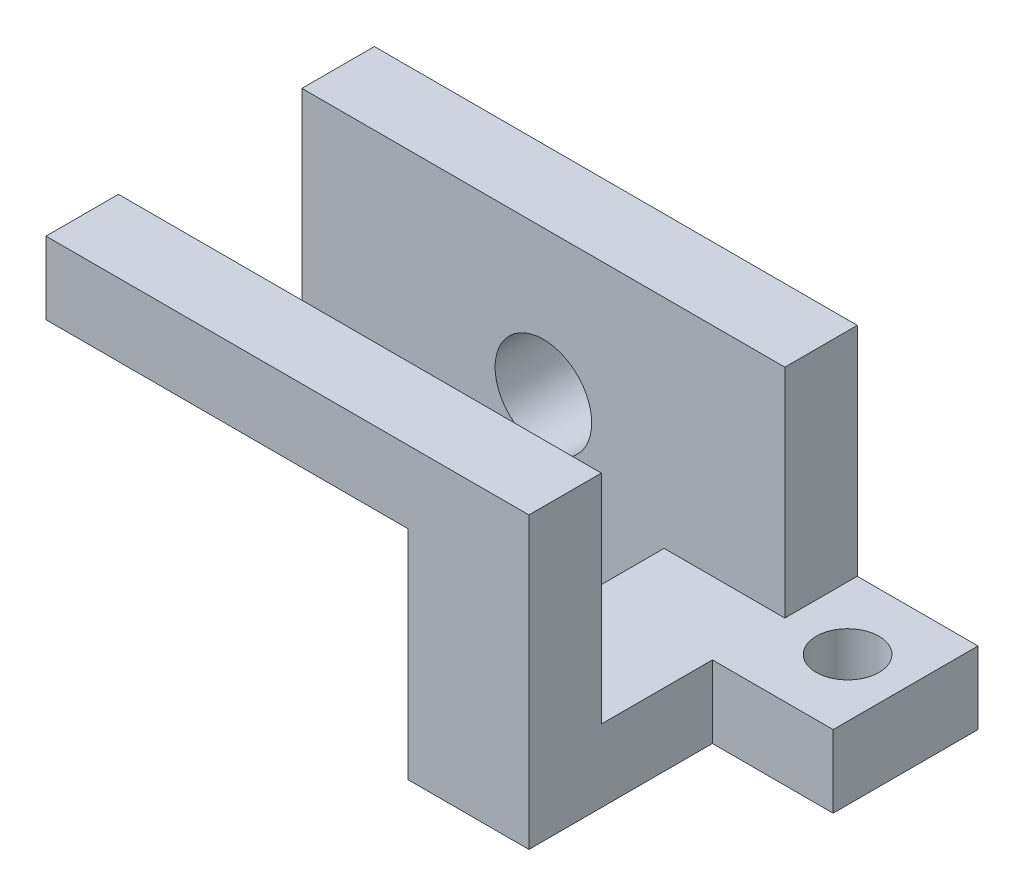
ISO-10303-21;
HEADER;
FILE_DESCRIPTION(('STEP AP214'),'2;1');
FILE_NAME('part.step','',(''),(''),'','','');
FILE_SCHEMA(('AUTOMOTIVE_DESIGN { 1 0 10303 214 1 1 1 1 }'));
ENDSEC;
DATA;
#1=APPLICATION_CONTEXT('core data for automotive mechanical design processes');
#2=APPLICATION_PROTOCOL_DEFINITION('international standard','automotive_design',2000,#1);
#3=PRODUCT_CONTEXT('',#1,'mechanical');
#4=PRODUCT('Part','Part','',(#3));
#5=PRODUCT_RELATED_PRODUCT_CATEGORY('part','',(#4));
#6=PRODUCT_DEFINITION_FORMATION('','',#4);
#7=PRODUCT_DEFINITION_CONTEXT('part definition',#1,'design');
#8=PRODUCT_DEFINITION('design','',#6,#7);
#9=PRODUCT_DEFINITION_SHAPE('','',#8);
#10=(LENGTH_UNIT() NAMED_UNIT(*) SI_UNIT(.MILLI.,.METRE.));
#11=(NAMED_UNIT(*) PLANE_ANGLE_UNIT() SI_UNIT($,.RADIAN.));
#12=(NAMED_UNIT(*) SI_UNIT($,.STERADIAN.) SOLID_ANGLE_UNIT());
#13=UNCERTAINTY_MEASURE_WITH_UNIT(LENGTH_MEASURE(1.E-05),#10,'distance_accuracy_value','');
#14=(GEOMETRIC_REPRESENTATION_CONTEXT(3) GLOBAL_UNCERTAINTY_ASSIGNED_CONTEXT((#13)) GLOBAL_UNIT_ASSIGNED_CONTEXT((#10,
#11,#12)) REPRESENTATION_CONTEXT('',''));
#15=CARTESIAN_POINT('',(0.,0.,0.));
#16=DIRECTION('',(0.,0.,1.));
#17=DIRECTION('',(1.,0.,0.));
#18=AXIS2_PLACEMENT_3D('',#15,#16,#17);
#19=CARTESIAN_POINT('',(0.,15.,0.));
#20=DIRECTION('',(0.,1.,0.));
#21=DIRECTION('',(0.,0.,1.));
#22=AXIS2_PLACEMENT_3D('',#19,#20,#21);
#23=PLANE('',#22);
#24=CARTESIAN_POINT('',(63.,15.,0.));
#25=DIRECTION('',(0.,1.,0.));
#26=DIRECTION('',(0.,0.,1.));
#27=AXIS2_PLACEMENT_3D('',#24,#25,#26);
#28=CIRCLE('',#27,6.5);
#29=CARTESIAN_POINT('',(63.,15.,6.5));
#30=VERTEX_POINT('',#29);
#31=EDGE_CURVE('E206',#30,#30,#28,.T.);
#32=ORIENTED_EDGE('',*,*,#31,.F.);
#33=EDGE_LOOP('',(#32));
#34=FACE_BOUND('',#33,.T.);
#35=DIRECTION('',(0.,0.,1.));
#36=VECTOR('',#35,1.);
#37=CARTESIAN_POINT('',(25.,15.,0.));
#38=LINE('',#37,#36);
#39=CARTESIAN_POINT('',(25.,15.,0.));
#40=VERTEX_POINT('',#39);
#41=CARTESIAN_POINT('',(25.,15.,38.));
#42=VERTEX_POINT('',#41);
#43=EDGE_CURVE('E203',#40,#42,#38,.T.);
#44=ORIENTED_EDGE('',*,*,#43,.T.);
#45=DIRECTION('',(1.,0.,0.));
#46=VECTOR('',#45,1.);
#47=CARTESIAN_POINT('',(0.,15.,38.));
#48=LINE('',#47,#46);
#49=CARTESIAN_POINT('',(50.,15.,38.));
#50=VERTEX_POINT('',#49);
#51=EDGE_CURVE('E11',#42,#50,#48,.T.);
#52=ORIENTED_EDGE('',*,*,#51,.T.);
#53=DIRECTION('',(0.,0.,1.));
#54=VECTOR('',#53,1.);
#55=CARTESIAN_POINT('',(50.,15.,0.));
#56=LINE('',#55,#54);
#57=CARTESIAN_POINT('',(50.,15.,15.));
#58=VERTEX_POINT('',#57);
#59=EDGE_CURVE('E182',#58,#50,#56,.T.);
#60=ORIENTED_EDGE('',*,*,#59,.F.);
#61=DIRECTION('',(1.,0.,0.));
#62=VECTOR('',#61,1.);
#63=CARTESIAN_POINT('',(0.,15.,15.));
#64=LINE('',#63,#62);
#65=CARTESIAN_POINT('',(75.,15.,15.));
#66=VERTEX_POINT('',#65);
#67=EDGE_CURVE('E185',#58,#66,#64,.T.);
#68=ORIENTED_EDGE('',*,*,#67,.T.);
#69=DIRECTION('',(0.,0.,1.));
#70=VECTOR('',#69,1.);
#71=CARTESIAN_POINT('',(75.,15.,0.));
#72=LINE('',#71,#70);
#73=CARTESIAN_POINT('',(75.,15.,-15.));
#74=VERTEX_POINT('',#73);
#75=EDGE_CURVE('E189',#74,#66,#72,.T.);
#76=ORIENTED_EDGE('',*,*,#75,.F.);
#77=DIRECTION('',(1.,0.,0.));
#78=VECTOR('',#77,1.);
#79=CARTESIAN_POINT('',(0.,15.,-15.));
#80=LINE('',#79,#78);
#81=CARTESIAN_POINT('',(50.,15.,-15.));
#82=VERTEX_POINT('',#81);
#83=EDGE_CURVE('E193',#82,#74,#80,.T.);
#84=ORIENTED_EDGE('',*,*,#83,.F.);
#85=DIRECTION('',(0.,0.,-1.));
#86=VECTOR('',#85,1.);
#87=CARTESIAN_POINT('',(50.,15.,0.));
#88=LINE('',#87,#86);
#89=CARTESIAN_POINT('',(50.,15.,0.));
#90=VERTEX_POINT('',#89);
#91=EDGE_CURVE('E197',#90,#82,#88,.T.);
#92=ORIENTED_EDGE('',*,*,#91,.F.);
#93=DIRECTION('',(1.,0.,0.));
#94=VECTOR('',#93,1.);
#95=CARTESIAN_POINT('',(0.,15.,0.));
#96=LINE('',#95,#94);
#97=EDGE_CURVE('E200',#40,#90,#96,.T.);
#98=ORIENTED_EDGE('',*,*,#97,.F.);
#99=EDGE_LOOP('',(#44,#52,#60,#68,#76,#84,#92,#98));
#100=FACE_BOUND('',#99,.T.);
#101=ADVANCED_FACE('F47',(#34,#100),#23,.T.);
#102=CARTESIAN_POINT('',(0.,60.,0.));
#103=DIRECTION('',(0.,0.,-1.));
#104=DIRECTION('',(-1.,0.,0.));
#105=AXIS2_PLACEMENT_3D('',#102,#103,#104);
#106=PLANE('',#105);
#107=CARTESIAN_POINT('',(0.,30.,0.));
#108=DIRECTION('',(0.,0.,1.));
#109=DIRECTION('',(1.,0.,0.));
#110=AXIS2_PLACEMENT_3D('',#107,#108,#109);
#111=CIRCLE('',#110,10.);
#112=CARTESIAN_POINT('',(10.,30.,0.));
#113=VERTEX_POINT('',#112);
#114=EDGE_CURVE('E320',#113,#113,#111,.T.);
#115=ORIENTED_EDGE('',*,*,#114,.F.);
#116=EDGE_LOOP('',(#115));
#117=FACE_BOUND('',#116,.T.);
#118=DIRECTION('',(0.,-1.,0.));
#119=VECTOR('',#118,1.);
#120=CARTESIAN_POINT('',(25.,15.,0.));
#121=LINE('',#120,#119);
#122=CARTESIAN_POINT('',(25.,0.,0.));
#123=VERTEX_POINT('',#122);
#124=EDGE_CURVE('E232',#40,#123,#121,.T.);
#125=ORIENTED_EDGE('',*,*,#124,.F.);
#126=ORIENTED_EDGE('',*,*,#97,.T.);
#127=DIRECTION('',(0.,-1.,0.));
#128=VECTOR('',#127,1.);
#129=CARTESIAN_POINT('',(50.,60.,0.));
#130=LINE('',#129,#128);
#131=CARTESIAN_POINT('',(50.,60.,0.));
#132=VERTEX_POINT('',#131);
#133=EDGE_CURVE('E56',#132,#90,#130,.T.);
#134=ORIENTED_EDGE('',*,*,#133,.F.);
#135=DIRECTION('',(1.,0.,0.));
#136=VECTOR('',#135,1.);
#137=CARTESIAN_POINT('',(0.,60.,0.));
#138=LINE('',#137,#136);
#139=CARTESIAN_POINT('',(-50.,60.,0.));
#140=VERTEX_POINT('',#139);
#141=EDGE_CURVE('E251',#140,#132,#138,.T.);
#142=ORIENTED_EDGE('',*,*,#141,.F.);
#143=DIRECTION('',(0.,-1.,0.));
#144=VECTOR('',#143,1.);
#145=CARTESIAN_POINT('',(-50.,60.,0.));
#146=LINE('',#145,#144);
#147=CARTESIAN_POINT('',(-50.,0.,0.));
#148=VERTEX_POINT('',#147);
#149=EDGE_CURVE('E267',#140,#148,#146,.T.);
#150=ORIENTED_EDGE('',*,*,#149,.T.);
#151=DIRECTION('',(1.,0.,0.));
#152=VECTOR('',#151,1.);
#153=CARTESIAN_POINT('',(0.,0.,0.));
#154=LINE('',#153,#152);
#155=EDGE_CURVE('E250',#148,#123,#154,.T.);
#156=ORIENTED_EDGE('',*,*,#155,.T.);
#157=EDGE_LOOP('',(#125,#126,#134,#142,#150,#156));
#158=FACE_BOUND('',#157,.T.);
#159=ADVANCED_FACE('F49',(#117,#158),#106,.F.);
#160=CARTESIAN_POINT('',(50.,60.,0.));
#161=DIRECTION('',(-1.,0.,0.));
#162=DIRECTION('',(0.,0.,1.));
#163=AXIS2_PLACEMENT_3D('',#160,#161,#162);
#164=PLANE('',#163);
#165=ORIENTED_EDGE('',*,*,#133,.T.);
#166=ORIENTED_EDGE('',*,*,#91,.T.);
#167=DIRECTION('',(0.,-1.,0.));
#168=VECTOR('',#167,1.);
#169=CARTESIAN_POINT('',(50.,60.,-15.));
#170=LINE('',#169,#168);
#171=CARTESIAN_POINT('',(50.,60.,-15.));
#172=VERTEX_POINT('',#171);
#173=EDGE_CURVE('E281',#172,#82,#170,.T.);
#174=ORIENTED_EDGE('',*,*,#173,.F.);
#175=DIRECTION('',(0.,0.,-1.));
#176=VECTOR('',#175,1.);
#177=CARTESIAN_POINT('',(50.,60.,0.));
#178=LINE('',#177,#176);
#179=EDGE_CURVE('E255',#132,#172,#178,.T.);
#180=ORIENTED_EDGE('',*,*,#179,.F.);
#181=EDGE_LOOP('',(#165,#166,#174,#180));
#182=FACE_BOUND('',#181,.T.);
#183=ADVANCED_FACE('F289',(#182),#164,.F.);
#184=CARTESIAN_POINT('',(0.,60.,-15.));
#185=DIRECTION('',(0.,0.,-1.));
#186=DIRECTION('',(-1.,0.,0.));
#187=AXIS2_PLACEMENT_3D('',#184,#185,#186);
#188=PLANE('',#187);
#189=CARTESIAN_POINT('',(0.,30.,-15.));
#190=DIRECTION('',(0.,0.,1.));
#191=DIRECTION('',(1.,0.,0.));
#192=AXIS2_PLACEMENT_3D('',#189,#190,#191);
#193=CIRCLE('',#192,10.);
#194=CARTESIAN_POINT('',(10.,30.,-15.));
#195=VERTEX_POINT('',#194);
#196=EDGE_CURVE('E323',#195,#195,#193,.T.);
#197=ORIENTED_EDGE('',*,*,#196,.T.);
#198=EDGE_LOOP('',(#197));
#199=FACE_BOUND('',#198,.T.);
#200=DIRECTION('',(1.,0.,0.));
#201=VECTOR('',#200,1.);
#202=CARTESIAN_POINT('',(0.,0.,-15.));
#203=LINE('',#202,#201);
#204=CARTESIAN_POINT('',(-50.,0.,-15.));
#205=VERTEX_POINT('',#204);
#206=CARTESIAN_POINT('',(75.,0.,-15.));
#207=VERTEX_POINT('',#206);
#208=EDGE_CURVE('E270',#205,#207,#203,.T.);
#209=ORIENTED_EDGE('',*,*,#208,.F.);
#210=DIRECTION('',(0.,-1.,0.));
#211=VECTOR('',#210,1.);
#212=CARTESIAN_POINT('',(-50.,60.,-15.));
#213=LINE('',#212,#211);
#214=CARTESIAN_POINT('',(-50.,60.,-15.));
#215=VERTEX_POINT('',#214);
#216=EDGE_CURVE('E278',#215,#205,#213,.T.);
#217=ORIENTED_EDGE('',*,*,#216,.F.);
#218=DIRECTION('',(1.,0.,0.));
#219=VECTOR('',#218,1.);
#220=CARTESIAN_POINT('',(0.,60.,-15.));
#221=LINE('',#220,#219);
#222=EDGE_CURVE('E259',#215,#172,#221,.T.);
#223=ORIENTED_EDGE('',*,*,#222,.T.);
#224=ORIENTED_EDGE('',*,*,#173,.T.);
#225=ORIENTED_EDGE('',*,*,#83,.T.);
#226=DIRECTION('',(0.,-1.,0.));
#227=VECTOR('',#226,1.);
#228=CARTESIAN_POINT('',(75.,15.,-15.));
#229=LINE('',#228,#227);
#230=EDGE_CURVE('E236',#74,#207,#229,.T.);
#231=ORIENTED_EDGE('',*,*,#230,.T.);
#232=EDGE_LOOP('',(#209,#217,#223,#224,#225,#231));
#233=FACE_BOUND('',#232,.T.);
#234=ADVANCED_FACE('F298',(#199,#233),#188,.T.);
#235=CARTESIAN_POINT('',(-50.,60.,0.));
#236=DIRECTION('',(-1.,0.,0.));
#237=DIRECTION('',(0.,0.,1.));
#238=AXIS2_PLACEMENT_3D('',#235,#236,#237);
#239=PLANE('',#238);
#240=DIRECTION('',(0.,0.,-1.));
#241=VECTOR('',#240,1.);
#242=CARTESIAN_POINT('',(-50.,0.,0.));
#243=LINE('',#242,#241);
#244=EDGE_CURVE('E256',#148,#205,#243,.T.);
#245=ORIENTED_EDGE('',*,*,#244,.F.);
#246=ORIENTED_EDGE('',*,*,#149,.F.);
#247=DIRECTION('',(0.,0.,-1.));
#248=VECTOR('',#247,1.);
#249=CARTESIAN_POINT('',(-50.,60.,0.));
#250=LINE('',#249,#248);
#251=EDGE_CURVE('E263',#140,#215,#250,.T.);
#252=ORIENTED_EDGE('',*,*,#251,.T.);
#253=ORIENTED_EDGE('',*,*,#216,.T.);
#254=EDGE_LOOP('',(#245,#246,#252,#253));
#255=FACE_BOUND('',#254,.T.);
#256=ADVANCED_FACE('F306',(#255),#239,.T.);
#257=CARTESIAN_POINT('',(0.,60.,0.));
#258=DIRECTION('',(0.,1.,0.));
#259=DIRECTION('',(0.,0.,1.));
#260=AXIS2_PLACEMENT_3D('',#257,#258,#259);
#261=PLANE('',#260);
#262=ORIENTED_EDGE('',*,*,#141,.T.);
#263=ORIENTED_EDGE('',*,*,#179,.T.);
#264=ORIENTED_EDGE('',*,*,#222,.F.);
#265=ORIENTED_EDGE('',*,*,#251,.F.);
#266=EDGE_LOOP('',(#262,#263,#264,#265));
#267=FACE_BOUND('',#266,.T.);
#268=ADVANCED_FACE('F303',(#267),#261,.T.);
#269=CARTESIAN_POINT('',(0.,0.,0.));
#270=DIRECTION('',(0.,1.,0.));
#271=DIRECTION('',(0.,0.,1.));
#272=AXIS2_PLACEMENT_3D('',#269,#270,#271);
#273=PLANE('',#272);
#274=DIRECTION('',(-1.,0.,0.));
#275=VECTOR('',#274,1.);
#276=CARTESIAN_POINT('',(0.,0.,53.));
#277=LINE('',#276,#275);
#278=CARTESIAN_POINT('',(50.,0.,53.));
#279=VERTEX_POINT('',#278);
#280=CARTESIAN_POINT('',(25.,0.,53.));
#281=VERTEX_POINT('',#280);
#282=EDGE_CURVE('E176',#279,#281,#277,.T.);
#283=ORIENTED_EDGE('',*,*,#282,.T.);
#284=DIRECTION('',(0.,0.,1.));
#285=VECTOR('',#284,1.);
#286=CARTESIAN_POINT('',(25.,0.,0.));
#287=LINE('',#286,#285);
#288=EDGE_CURVE('E224',#123,#281,#287,.T.);
#289=ORIENTED_EDGE('',*,*,#288,.F.);
#290=ORIENTED_EDGE('',*,*,#155,.F.);
#291=ORIENTED_EDGE('',*,*,#244,.T.);
#292=ORIENTED_EDGE('',*,*,#208,.T.);
#293=DIRECTION('',(0.,0.,1.));
#294=VECTOR('',#293,1.);
#295=CARTESIAN_POINT('',(75.,0.,0.));
#296=LINE('',#295,#294);
#297=CARTESIAN_POINT('',(75.,0.,15.));
#298=VERTEX_POINT('',#297);
#299=EDGE_CURVE('E220',#207,#298,#296,.T.);
#300=ORIENTED_EDGE('',*,*,#299,.T.);
#301=DIRECTION('',(1.,0.,0.));
#302=VECTOR('',#301,1.);
#303=CARTESIAN_POINT('',(0.,0.,15.));
#304=LINE('',#303,#302);
#305=CARTESIAN_POINT('',(50.,0.,15.));
#306=VERTEX_POINT('',#305);
#307=EDGE_CURVE('E216',#306,#298,#304,.T.);
#308=ORIENTED_EDGE('',*,*,#307,.F.);
#309=DIRECTION('',(0.,0.,1.));
#310=VECTOR('',#309,1.);
#311=CARTESIAN_POINT('',(50.,0.,0.));
#312=LINE('',#311,#310);
#313=EDGE_CURVE('E213',#306,#279,#312,.T.);
#314=ORIENTED_EDGE('',*,*,#313,.T.);
#315=EDGE_LOOP('',(#283,#289,#290,#291,#292,#300,#308,#314));
#316=FACE_BOUND('',#315,.T.);
#317=CARTESIAN_POINT('',(63.,0.,0.));
#318=DIRECTION('',(0.,1.,0.));
#319=DIRECTION('',(0.,0.,1.));
#320=AXIS2_PLACEMENT_3D('',#317,#318,#319);
#321=CIRCLE('',#320,6.5);
#322=CARTESIAN_POINT('',(63.,0.,6.5));
#323=VERTEX_POINT('',#322);
#324=EDGE_CURVE('E186',#323,#323,#321,.T.);
#325=ORIENTED_EDGE('',*,*,#324,.T.);
#326=EDGE_LOOP('',(#325));
#327=FACE_BOUND('',#326,.T.);
#328=ADVANCED_FACE('F364',(#316,#327),#273,.F.);
#329=CARTESIAN_POINT('',(0.,15.,53.));
#330=DIRECTION('',(0.,0.,1.));
#331=DIRECTION('',(1.,0.,0.));
#332=AXIS2_PLACEMENT_3D('',#329,#330,#331);
#333=PLANE('',#332);
#334=ORIENTED_EDGE('',*,*,#282,.F.);
#335=DIRECTION('',(0.,-1.,0.));
#336=VECTOR('',#335,1.);
#337=CARTESIAN_POINT('',(50.,15.,53.));
#338=LINE('',#337,#336);
#339=CARTESIAN_POINT('',(50.,60.,53.));
#340=VERTEX_POINT('',#339);
#341=EDGE_CURVE('E246',#340,#279,#338,.T.);
#342=ORIENTED_EDGE('',*,*,#341,.F.);
#343=DIRECTION('',(-1.,0.,0.));
#344=VECTOR('',#343,1.);
#345=CARTESIAN_POINT('',(0.,60.,53.));
#346=LINE('',#345,#344);
#347=CARTESIAN_POINT('',(-50.,60.,53.));
#348=VERTEX_POINT('',#347);
#349=EDGE_CURVE('E342',#340,#348,#346,.T.);
#350=ORIENTED_EDGE('',*,*,#349,.T.);
#351=DIRECTION('',(0.,1.,0.));
#352=VECTOR('',#351,1.);
#353=CARTESIAN_POINT('',(-50.,45.,53.));
#354=LINE('',#353,#352);
#355=CARTESIAN_POINT('',(-50.,45.,53.));
#356=VERTEX_POINT('',#355);
#357=EDGE_CURVE('E338',#356,#348,#354,.T.);
#358=ORIENTED_EDGE('',*,*,#357,.F.);
#359=DIRECTION('',(1.,0.,0.));
#360=VECTOR('',#359,1.);
#361=CARTESIAN_POINT('',(0.,45.,53.));
#362=LINE('',#361,#360);
#363=CARTESIAN_POINT('',(25.,45.,53.));
#364=VERTEX_POINT('',#363);
#365=EDGE_CURVE('E331',#356,#364,#362,.T.);
#366=ORIENTED_EDGE('',*,*,#365,.T.);
#367=DIRECTION('',(0.,-1.,0.));
#368=VECTOR('',#367,1.);
#369=CARTESIAN_POINT('',(25.,15.,53.));
#370=LINE('',#369,#368);
#371=EDGE_CURVE('E164',#364,#281,#370,.T.);
#372=ORIENTED_EDGE('',*,*,#371,.T.);
#373=EDGE_LOOP('',(#334,#342,#350,#358,#366,#372));
#374=FACE_BOUND('',#373,.T.);
#375=ADVANCED_FACE('F359',(#374),#333,.T.);
#376=CARTESIAN_POINT('',(50.,15.,0.));
#377=DIRECTION('',(1.,0.,0.));
#378=DIRECTION('',(0.,0.,-1.));
#379=AXIS2_PLACEMENT_3D('',#376,#377,#378);
#380=PLANE('',#379);
#381=ORIENTED_EDGE('',*,*,#341,.T.);
#382=ORIENTED_EDGE('',*,*,#313,.F.);
#383=DIRECTION('',(0.,-1.,0.));
#384=VECTOR('',#383,1.);
#385=CARTESIAN_POINT('',(50.,15.,15.));
#386=LINE('',#385,#384);
#387=EDGE_CURVE('E243',#58,#306,#386,.T.);
#388=ORIENTED_EDGE('',*,*,#387,.F.);
#389=ORIENTED_EDGE('',*,*,#59,.T.);
#390=DIRECTION('',(0.,-1.,0.));
#391=VECTOR('',#390,1.);
#392=CARTESIAN_POINT('',(50.,60.,38.));
#393=LINE('',#392,#391);
#394=CARTESIAN_POINT('',(50.,60.,38.));
#395=VERTEX_POINT('',#394);
#396=EDGE_CURVE('E171',#395,#50,#393,.T.);
#397=ORIENTED_EDGE('',*,*,#396,.F.);
#398=DIRECTION('',(0.,0.,1.));
#399=VECTOR('',#398,1.);
#400=CARTESIAN_POINT('',(50.,60.,0.));
#401=LINE('',#400,#399);
#402=EDGE_CURVE('E178',#395,#340,#401,.T.);
#403=ORIENTED_EDGE('',*,*,#402,.T.);
#404=EDGE_LOOP('',(#381,#382,#388,#389,#397,#403));
#405=FACE_BOUND('',#404,.T.);
#406=ADVANCED_FACE('F350',(#405),#380,.T.);
#407=CARTESIAN_POINT('',(0.,15.,15.));
#408=DIRECTION('',(0.,0.,-1.));
#409=DIRECTION('',(-1.,0.,0.));
#410=AXIS2_PLACEMENT_3D('',#407,#408,#409);
#411=PLANE('',#410);
#412=ORIENTED_EDGE('',*,*,#307,.T.);
#413=DIRECTION('',(0.,-1.,0.));
#414=VECTOR('',#413,1.);
#415=CARTESIAN_POINT('',(75.,15.,15.));
#416=LINE('',#415,#414);
#417=EDGE_CURVE('E240',#66,#298,#416,.T.);
#418=ORIENTED_EDGE('',*,*,#417,.F.);
#419=ORIENTED_EDGE('',*,*,#67,.F.);
#420=ORIENTED_EDGE('',*,*,#387,.T.);
#421=EDGE_LOOP('',(#412,#418,#419,#420));
#422=FACE_BOUND('',#421,.T.);
#423=ADVANCED_FACE('F370',(#422),#411,.F.);
#424=CARTESIAN_POINT('',(75.,15.,0.));
#425=DIRECTION('',(1.,0.,0.));
#426=DIRECTION('',(0.,0.,-1.));
#427=AXIS2_PLACEMENT_3D('',#424,#425,#426);
#428=PLANE('',#427);
#429=ORIENTED_EDGE('',*,*,#299,.F.);
#430=ORIENTED_EDGE('',*,*,#230,.F.);
#431=ORIENTED_EDGE('',*,*,#75,.T.);
#432=ORIENTED_EDGE('',*,*,#417,.T.);
#433=EDGE_LOOP('',(#429,#430,#431,#432));
#434=FACE_BOUND('',#433,.T.);
#435=ADVANCED_FACE('F372',(#434),#428,.T.);
#436=CARTESIAN_POINT('',(25.,15.,0.));
#437=DIRECTION('',(1.,0.,0.));
#438=DIRECTION('',(0.,0.,-1.));
#439=AXIS2_PLACEMENT_3D('',#436,#437,#438);
#440=PLANE('',#439);
#441=ORIENTED_EDGE('',*,*,#371,.F.);
#442=DIRECTION('',(0.,0.,-1.));
#443=VECTOR('',#442,1.);
#444=CARTESIAN_POINT('',(25.,45.,0.));
#445=LINE('',#444,#443);
#446=CARTESIAN_POINT('',(25.,45.,38.));
#447=VERTEX_POINT('',#446);
#448=EDGE_CURVE('E152',#364,#447,#445,.T.);
#449=ORIENTED_EDGE('',*,*,#448,.T.);
#450=DIRECTION('',(0.,-1.,0.));
#451=VECTOR('',#450,1.);
#452=CARTESIAN_POINT('',(25.,60.,38.));
#453=LINE('',#452,#451);
#454=EDGE_CURVE('E63',#447,#42,#453,.T.);
#455=ORIENTED_EDGE('',*,*,#454,.T.);
#456=ORIENTED_EDGE('',*,*,#43,.F.);
#457=ORIENTED_EDGE('',*,*,#124,.T.);
#458=ORIENTED_EDGE('',*,*,#288,.T.);
#459=EDGE_LOOP('',(#441,#449,#455,#456,#457,#458));
#460=FACE_BOUND('',#459,.T.);
#461=ADVANCED_FACE('F162',(#460),#440,.F.);
#462=CARTESIAN_POINT('',(63.,15.,0.));
#463=DIRECTION('',(0.,-1.,0.));
#464=DIRECTION('',(0.,0.,-1.));
#465=AXIS2_PLACEMENT_3D('',#462,#463,#464);
#466=CYLINDRICAL_SURFACE('',#465,6.5);
#467=ORIENTED_EDGE('',*,*,#31,.T.);
#468=EDGE_LOOP('',(#467));
#469=FACE_BOUND('',#468,.T.);
#470=ORIENTED_EDGE('',*,*,#324,.F.);
#471=EDGE_LOOP('',(#470));
#472=FACE_BOUND('',#471,.T.);
#473=ADVANCED_FACE('F380',(#469,#472),#466,.F.);
#474=CARTESIAN_POINT('',(0.,60.,38.));
#475=DIRECTION('',(0.,0.,1.));
#476=DIRECTION('',(1.,0.,0.));
#477=AXIS2_PLACEMENT_3D('',#474,#475,#476);
#478=PLANE('',#477);
#479=ORIENTED_EDGE('',*,*,#51,.F.);
#480=ORIENTED_EDGE('',*,*,#454,.F.);
#481=DIRECTION('',(1.,0.,0.));
#482=VECTOR('',#481,1.);
#483=CARTESIAN_POINT('',(0.,45.,38.));
#484=LINE('',#483,#482);
#485=CARTESIAN_POINT('',(-50.,45.,38.));
#486=VERTEX_POINT('',#485);
#487=EDGE_CURVE('E149',#486,#447,#484,.T.);
#488=ORIENTED_EDGE('',*,*,#487,.F.);
#489=DIRECTION('',(0.,1.,0.));
#490=VECTOR('',#489,1.);
#491=CARTESIAN_POINT('',(-50.,45.,38.));
#492=LINE('',#491,#490);
#493=CARTESIAN_POINT('',(-50.,60.,38.));
#494=VERTEX_POINT('',#493);
#495=EDGE_CURVE('E334',#486,#494,#492,.T.);
#496=ORIENTED_EDGE('',*,*,#495,.T.);
#497=DIRECTION('',(-1.,0.,0.));
#498=VECTOR('',#497,1.);
#499=CARTESIAN_POINT('',(0.,60.,38.));
#500=LINE('',#499,#498);
#501=EDGE_CURVE('E172',#395,#494,#500,.T.);
#502=ORIENTED_EDGE('',*,*,#501,.F.);
#503=ORIENTED_EDGE('',*,*,#396,.T.);
#504=EDGE_LOOP('',(#479,#480,#488,#496,#502,#503));
#505=FACE_BOUND('',#504,.T.);
#506=ADVANCED_FACE('F168',(#505),#478,.F.);
#507=CARTESIAN_POINT('',(0.,60.,0.));
#508=DIRECTION('',(0.,1.,0.));
#509=DIRECTION('',(0.,0.,1.));
#510=AXIS2_PLACEMENT_3D('',#507,#508,#509);
#511=PLANE('',#510);
#512=ORIENTED_EDGE('',*,*,#349,.F.);
#513=ORIENTED_EDGE('',*,*,#402,.F.);
#514=ORIENTED_EDGE('',*,*,#501,.T.);
#515=DIRECTION('',(0.,0.,-1.));
#516=VECTOR('',#515,1.);
#517=CARTESIAN_POINT('',(-50.,60.,0.));
#518=LINE('',#517,#516);
#519=EDGE_CURVE('E166',#348,#494,#518,.T.);
#520=ORIENTED_EDGE('',*,*,#519,.F.);
#521=EDGE_LOOP('',(#512,#513,#514,#520));
#522=FACE_BOUND('',#521,.T.);
#523=ADVANCED_FACE('F356',(#522),#511,.T.);
#524=CARTESIAN_POINT('',(-50.,45.,0.));
#525=DIRECTION('',(1.,0.,0.));
#526=DIRECTION('',(0.,0.,-1.));
#527=AXIS2_PLACEMENT_3D('',#524,#525,#526);
#528=PLANE('',#527);
#529=ORIENTED_EDGE('',*,*,#519,.T.);
#530=ORIENTED_EDGE('',*,*,#495,.F.);
#531=DIRECTION('',(0.,0.,-1.));
#532=VECTOR('',#531,1.);
#533=CARTESIAN_POINT('',(-50.,45.,0.));
#534=LINE('',#533,#532);
#535=EDGE_CURVE('E155',#356,#486,#534,.T.);
#536=ORIENTED_EDGE('',*,*,#535,.F.);
#537=ORIENTED_EDGE('',*,*,#357,.T.);
#538=EDGE_LOOP('',(#529,#530,#536,#537));
#539=FACE_BOUND('',#538,.T.);
#540=ADVANCED_FACE('F361',(#539),#528,.F.);
#541=CARTESIAN_POINT('',(0.,45.,0.));
#542=DIRECTION('',(0.,-1.,0.));
#543=DIRECTION('',(0.,0.,-1.));
#544=AXIS2_PLACEMENT_3D('',#541,#542,#543);
#545=PLANE('',#544);
#546=ORIENTED_EDGE('',*,*,#448,.F.);
#547=ORIENTED_EDGE('',*,*,#365,.F.);
#548=ORIENTED_EDGE('',*,*,#535,.T.);
#549=ORIENTED_EDGE('',*,*,#487,.T.);
#550=EDGE_LOOP('',(#546,#547,#548,#549));
#551=FACE_BOUND('',#550,.T.);
#552=ADVANCED_FACE('F150',(#551),#545,.T.);
#553=CARTESIAN_POINT('',(0.,30.,-15.));
#554=DIRECTION('',(0.,0.,1.));
#555=DIRECTION('',(1.,0.,0.));
#556=AXIS2_PLACEMENT_3D('',#553,#554,#555);
#557=CYLINDRICAL_SURFACE('',#556,10.);
#558=ORIENTED_EDGE('',*,*,#196,.F.);
#559=EDGE_LOOP('',(#558));
#560=FACE_BOUND('',#559,.T.);
#561=ORIENTED_EDGE('',*,*,#114,.T.);
#562=EDGE_LOOP('',(#561));
#563=FACE_BOUND('',#562,.T.);
#564=ADVANCED_FACE('F401',(#560,#563),#557,.F.);
#565=CLOSED_SHELL('',(#101,#159,#183,#234,#256,#268,#328,#375,#406,#423,#435,#461,#473,#506,
#523,#540,#552,#564));
#566=MANIFOLD_SOLID_BREP('B2',#565);
#567=ADVANCED_BREP_SHAPE_REPRESENTATION('',(#18,#566),#14);
#568=SHAPE_DEFINITION_REPRESENTATION(#9,#567);
ENDSEC;
END-ISO-10303-21;
